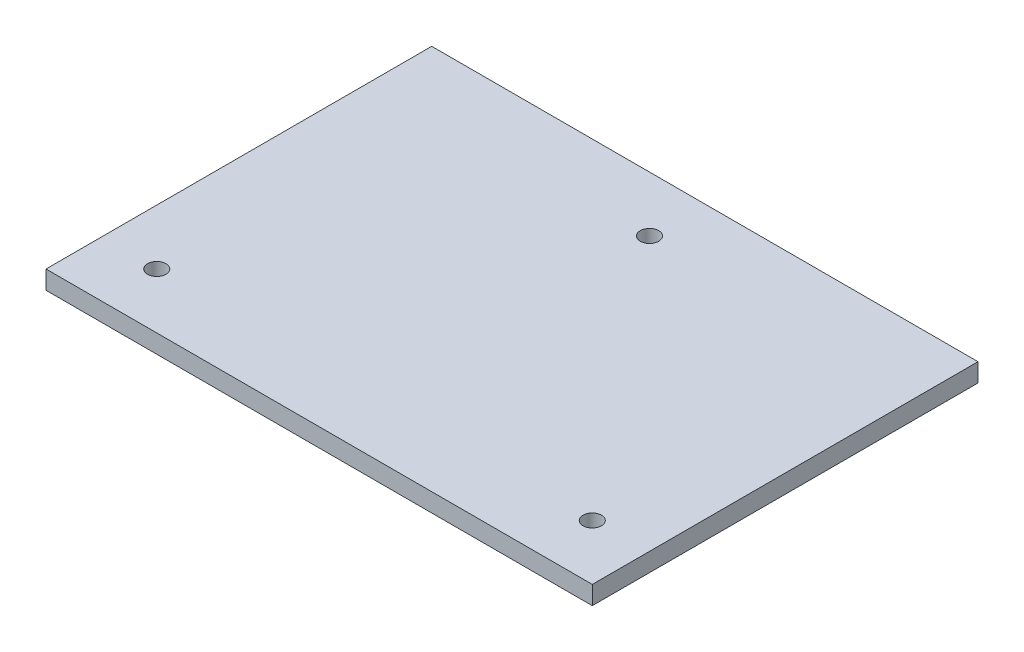
ISO-10303-21;
HEADER;
FILE_DESCRIPTION(('STEP AP214'),'2;1');
FILE_NAME('part.step','',(''),(''),'','','');
FILE_SCHEMA(('AUTOMOTIVE_DESIGN { 1 0 10303 214 1 1 1 1 }'));
ENDSEC;
DATA;
#1=APPLICATION_CONTEXT('core data for automotive mechanical design processes');
#2=APPLICATION_PROTOCOL_DEFINITION('international standard','automotive_design',2000,#1);
#3=PRODUCT_CONTEXT('',#1,'mechanical');
#4=PRODUCT('Part','Part','',(#3));
#5=PRODUCT_RELATED_PRODUCT_CATEGORY('part','',(#4));
#6=PRODUCT_DEFINITION_FORMATION('','',#4);
#7=PRODUCT_DEFINITION_CONTEXT('part definition',#1,'design');
#8=PRODUCT_DEFINITION('design','',#6,#7);
#9=PRODUCT_DEFINITION_SHAPE('','',#8);
#10=(LENGTH_UNIT() NAMED_UNIT(*) SI_UNIT(.MILLI.,.METRE.));
#11=(NAMED_UNIT(*) PLANE_ANGLE_UNIT() SI_UNIT($,.RADIAN.));
#12=(NAMED_UNIT(*) SI_UNIT($,.STERADIAN.) SOLID_ANGLE_UNIT());
#13=UNCERTAINTY_MEASURE_WITH_UNIT(LENGTH_MEASURE(1.E-05),#10,'distance_accuracy_value','');
#14=(GEOMETRIC_REPRESENTATION_CONTEXT(3) GLOBAL_UNCERTAINTY_ASSIGNED_CONTEXT((#13)) GLOBAL_UNIT_ASSIGNED_CONTEXT((#10,
#11,#12)) REPRESENTATION_CONTEXT('',''));
#15=CARTESIAN_POINT('',(0.,0.,0.));
#16=DIRECTION('',(0.,0.,1.));
#17=DIRECTION('',(1.,0.,0.));
#18=AXIS2_PLACEMENT_3D('',#15,#16,#17);
#19=CARTESIAN_POINT('',(148.,10.,104.5));
#20=DIRECTION('',(-1.,0.,0.));
#21=DIRECTION('',(0.,0.,1.));
#22=AXIS2_PLACEMENT_3D('',#19,#20,#21);
#23=PLANE('',#22);
#24=DIRECTION('',(0.,0.,-1.));
#25=VECTOR('',#24,1.);
#26=CARTESIAN_POINT('',(148.,0.,104.5));
#27=LINE('',#26,#25);
#28=CARTESIAN_POINT('',(148.,0.,104.5));
#29=VERTEX_POINT('',#28);
#30=CARTESIAN_POINT('',(148.,0.,-104.5));
#31=VERTEX_POINT('',#30);
#32=EDGE_CURVE('E94',#29,#31,#27,.T.);
#33=ORIENTED_EDGE('',*,*,#32,.T.);
#34=DIRECTION('',(0.,-1.,0.));
#35=VECTOR('',#34,1.);
#36=CARTESIAN_POINT('',(148.,10.,-104.5));
#37=LINE('',#36,#35);
#38=CARTESIAN_POINT('',(148.,10.,-104.5));
#39=VERTEX_POINT('',#38);
#40=EDGE_CURVE('E11',#39,#31,#37,.T.);
#41=ORIENTED_EDGE('',*,*,#40,.F.);
#42=DIRECTION('',(0.,0.,-1.));
#43=VECTOR('',#42,1.);
#44=CARTESIAN_POINT('',(148.,10.,104.5));
#45=LINE('',#44,#43);
#46=CARTESIAN_POINT('',(148.,10.,104.5));
#47=VERTEX_POINT('',#46);
#48=EDGE_CURVE('E82',#47,#39,#45,.T.);
#49=ORIENTED_EDGE('',*,*,#48,.F.);
#50=DIRECTION('',(0.,-1.,0.));
#51=VECTOR('',#50,1.);
#52=CARTESIAN_POINT('',(148.,10.,104.5));
#53=LINE('',#52,#51);
#54=EDGE_CURVE('E90',#47,#29,#53,.T.);
#55=ORIENTED_EDGE('',*,*,#54,.T.);
#56=EDGE_LOOP('',(#33,#41,#49,#55));
#57=FACE_BOUND('',#56,.T.);
#58=ADVANCED_FACE('F31',(#57),#23,.F.);
#59=CARTESIAN_POINT('',(-148.,10.,-104.5));
#60=DIRECTION('',(0.,0.,1.));
#61=DIRECTION('',(1.,0.,0.));
#62=AXIS2_PLACEMENT_3D('',#59,#60,#61);
#63=PLANE('',#62);
#64=DIRECTION('',(-1.,0.,0.));
#65=VECTOR('',#64,1.);
#66=CARTESIAN_POINT('',(-148.,0.,-104.5));
#67=LINE('',#66,#65);
#68=CARTESIAN_POINT('',(-148.,0.,-104.5));
#69=VERTEX_POINT('',#68);
#70=EDGE_CURVE('E86',#31,#69,#67,.T.);
#71=ORIENTED_EDGE('',*,*,#70,.T.);
#72=DIRECTION('',(0.,-1.,0.));
#73=VECTOR('',#72,1.);
#74=CARTESIAN_POINT('',(-148.,10.,-104.5));
#75=LINE('',#74,#73);
#76=CARTESIAN_POINT('',(-148.,10.,-104.5));
#77=VERTEX_POINT('',#76);
#78=EDGE_CURVE('E39',#77,#69,#75,.T.);
#79=ORIENTED_EDGE('',*,*,#78,.F.);
#80=DIRECTION('',(-1.,0.,0.));
#81=VECTOR('',#80,1.);
#82=CARTESIAN_POINT('',(-148.,10.,-104.5));
#83=LINE('',#82,#81);
#84=EDGE_CURVE('E77',#39,#77,#83,.T.);
#85=ORIENTED_EDGE('',*,*,#84,.F.);
#86=ORIENTED_EDGE('',*,*,#40,.T.);
#87=EDGE_LOOP('',(#71,#79,#85,#86));
#88=FACE_BOUND('',#87,.T.);
#89=ADVANCED_FACE('F85',(#88),#63,.F.);
#90=CARTESIAN_POINT('',(-148.,10.,104.5));
#91=DIRECTION('',(1.,0.,0.));
#92=DIRECTION('',(0.,0.,-1.));
#93=AXIS2_PLACEMENT_3D('',#90,#91,#92);
#94=PLANE('',#93);
#95=DIRECTION('',(0.,0.,1.));
#96=VECTOR('',#95,1.);
#97=CARTESIAN_POINT('',(-148.,0.,104.5));
#98=LINE('',#97,#96);
#99=CARTESIAN_POINT('',(-148.,0.,104.5));
#100=VERTEX_POINT('',#99);
#101=EDGE_CURVE('E64',#69,#100,#98,.T.);
#102=ORIENTED_EDGE('',*,*,#101,.T.);
#103=DIRECTION('',(0.,-1.,0.));
#104=VECTOR('',#103,1.);
#105=CARTESIAN_POINT('',(-148.,10.,104.5));
#106=LINE('',#105,#104);
#107=CARTESIAN_POINT('',(-148.,10.,104.5));
#108=VERTEX_POINT('',#107);
#109=EDGE_CURVE('E87',#108,#100,#106,.T.);
#110=ORIENTED_EDGE('',*,*,#109,.F.);
#111=DIRECTION('',(0.,0.,1.));
#112=VECTOR('',#111,1.);
#113=CARTESIAN_POINT('',(-148.,10.,104.5));
#114=LINE('',#113,#112);
#115=EDGE_CURVE('E80',#77,#108,#114,.T.);
#116=ORIENTED_EDGE('',*,*,#115,.F.);
#117=ORIENTED_EDGE('',*,*,#78,.T.);
#118=EDGE_LOOP('',(#102,#110,#116,#117));
#119=FACE_BOUND('',#118,.T.);
#120=ADVANCED_FACE('F88',(#119),#94,.F.);
#121=CARTESIAN_POINT('',(-148.,10.,104.5));
#122=DIRECTION('',(0.,0.,-1.));
#123=DIRECTION('',(-1.,0.,0.));
#124=AXIS2_PLACEMENT_3D('',#121,#122,#123);
#125=PLANE('',#124);
#126=DIRECTION('',(1.,0.,0.));
#127=VECTOR('',#126,1.);
#128=CARTESIAN_POINT('',(-148.,0.,104.5));
#129=LINE('',#128,#127);
#130=EDGE_CURVE('E70',#100,#29,#129,.T.);
#131=ORIENTED_EDGE('',*,*,#130,.T.);
#132=ORIENTED_EDGE('',*,*,#54,.F.);
#133=DIRECTION('',(1.,0.,0.));
#134=VECTOR('',#133,1.);
#135=CARTESIAN_POINT('',(-148.,10.,104.5));
#136=LINE('',#135,#134);
#137=EDGE_CURVE('E47',#108,#47,#136,.T.);
#138=ORIENTED_EDGE('',*,*,#137,.F.);
#139=ORIENTED_EDGE('',*,*,#109,.T.);
#140=EDGE_LOOP('',(#131,#132,#138,#139));
#141=FACE_BOUND('',#140,.T.);
#142=ADVANCED_FACE('F102',(#141),#125,.F.);
#143=CARTESIAN_POINT('',(148.,10.,-104.5));
#144=DIRECTION('',(0.,-1.,0.));
#145=DIRECTION('',(0.,0.,-1.));
#146=AXIS2_PLACEMENT_3D('',#143,#144,#145);
#147=PLANE('',#146);
#148=CARTESIAN_POINT('',(0.,10.,-74.5));
#149=DIRECTION('',(0.,-1.,0.));
#150=DIRECTION('',(0.,0.,-1.));
#151=AXIS2_PLACEMENT_3D('',#148,#149,#150);
#152=CIRCLE('',#151,5.);
#153=CARTESIAN_POINT('',(0.,10.,-79.5));
#154=VERTEX_POINT('',#153);
#155=EDGE_CURVE('E119',#154,#154,#152,.F.);
#156=ORIENTED_EDGE('',*,*,#155,.F.);
#157=EDGE_LOOP('',(#156));
#158=FACE_BOUND('',#157,.T.);
#159=CARTESIAN_POINT('',(118.,10.,74.5));
#160=DIRECTION('',(0.,-1.,0.));
#161=DIRECTION('',(0.,0.,-1.));
#162=AXIS2_PLACEMENT_3D('',#159,#160,#161);
#163=CIRCLE('',#162,5.00000000000001);
#164=CARTESIAN_POINT('',(118.,10.,69.5));
#165=VERTEX_POINT('',#164);
#166=EDGE_CURVE('E113',#165,#165,#163,.F.);
#167=ORIENTED_EDGE('',*,*,#166,.F.);
#168=EDGE_LOOP('',(#167));
#169=FACE_BOUND('',#168,.T.);
#170=CARTESIAN_POINT('',(-118.,10.,74.5));
#171=DIRECTION('',(0.,-1.,0.));
#172=DIRECTION('',(0.,0.,-1.));
#173=AXIS2_PLACEMENT_3D('',#170,#171,#172);
#174=CIRCLE('',#173,5.00000000000001);
#175=CARTESIAN_POINT('',(-118.,10.,69.5));
#176=VERTEX_POINT('',#175);
#177=EDGE_CURVE('E97',#176,#176,#174,.F.);
#178=ORIENTED_EDGE('',*,*,#177,.F.);
#179=EDGE_LOOP('',(#178));
#180=FACE_BOUND('',#179,.T.);
#181=ORIENTED_EDGE('',*,*,#48,.T.);
#182=ORIENTED_EDGE('',*,*,#84,.T.);
#183=ORIENTED_EDGE('',*,*,#115,.T.);
#184=ORIENTED_EDGE('',*,*,#137,.T.);
#185=EDGE_LOOP('',(#181,#182,#183,#184));
#186=FACE_BOUND('',#185,.T.);
#187=ADVANCED_FACE('F78',(#158,#169,#180,#186),#147,.F.);
#188=CARTESIAN_POINT('',(148.,0.,-104.5));
#189=DIRECTION('',(0.,-1.,0.));
#190=DIRECTION('',(0.,0.,-1.));
#191=AXIS2_PLACEMENT_3D('',#188,#189,#190);
#192=PLANE('',#191);
#193=CARTESIAN_POINT('',(0.,0.,-74.5));
#194=DIRECTION('',(0.,-1.,0.));
#195=DIRECTION('',(0.,0.,-1.));
#196=AXIS2_PLACEMENT_3D('',#193,#194,#195);
#197=CIRCLE('',#196,5.);
#198=CARTESIAN_POINT('',(0.,0.,-79.5));
#199=VERTEX_POINT('',#198);
#200=EDGE_CURVE('E122',#199,#199,#197,.T.);
#201=ORIENTED_EDGE('',*,*,#200,.F.);
#202=EDGE_LOOP('',(#201));
#203=FACE_BOUND('',#202,.T.);
#204=CARTESIAN_POINT('',(118.,0.,74.5));
#205=DIRECTION('',(0.,-1.,0.));
#206=DIRECTION('',(0.,0.,-1.));
#207=AXIS2_PLACEMENT_3D('',#204,#205,#206);
#208=CIRCLE('',#207,5.00000000000001);
#209=CARTESIAN_POINT('',(118.,0.,69.5));
#210=VERTEX_POINT('',#209);
#211=EDGE_CURVE('E116',#210,#210,#208,.T.);
#212=ORIENTED_EDGE('',*,*,#211,.F.);
#213=EDGE_LOOP('',(#212));
#214=FACE_BOUND('',#213,.T.);
#215=CARTESIAN_POINT('',(-118.,0.,74.5));
#216=DIRECTION('',(0.,-1.,0.));
#217=DIRECTION('',(0.,0.,-1.));
#218=AXIS2_PLACEMENT_3D('',#215,#216,#217);
#219=CIRCLE('',#218,5.00000000000001);
#220=CARTESIAN_POINT('',(-118.,0.,69.5));
#221=VERTEX_POINT('',#220);
#222=EDGE_CURVE('E110',#221,#221,#219,.T.);
#223=ORIENTED_EDGE('',*,*,#222,.F.);
#224=EDGE_LOOP('',(#223));
#225=FACE_BOUND('',#224,.T.);
#226=ORIENTED_EDGE('',*,*,#32,.F.);
#227=ORIENTED_EDGE('',*,*,#130,.F.);
#228=ORIENTED_EDGE('',*,*,#101,.F.);
#229=ORIENTED_EDGE('',*,*,#70,.F.);
#230=EDGE_LOOP('',(#226,#227,#228,#229));
#231=FACE_BOUND('',#230,.T.);
#232=ADVANCED_FACE('F105',(#203,#214,#225,#231),#192,.T.);
#233=CARTESIAN_POINT('',(-118.,10.001,74.5));
#234=DIRECTION('',(0.,-1.,0.));
#235=DIRECTION('',(0.,0.,-1.));
#236=AXIS2_PLACEMENT_3D('',#233,#234,#235);
#237=CYLINDRICAL_SURFACE('',#236,5.00000000000001);
#238=ORIENTED_EDGE('',*,*,#222,.T.);
#239=EDGE_LOOP('',(#238));
#240=FACE_BOUND('',#239,.T.);
#241=ORIENTED_EDGE('',*,*,#177,.T.);
#242=EDGE_LOOP('',(#241));
#243=FACE_BOUND('',#242,.T.);
#244=ADVANCED_FACE('F131',(#240,#243),#237,.F.);
#245=CARTESIAN_POINT('',(118.,10.001,74.5));
#246=DIRECTION('',(0.,-1.,0.));
#247=DIRECTION('',(0.,0.,-1.));
#248=AXIS2_PLACEMENT_3D('',#245,#246,#247);
#249=CYLINDRICAL_SURFACE('',#248,5.00000000000001);
#250=ORIENTED_EDGE('',*,*,#211,.T.);
#251=EDGE_LOOP('',(#250));
#252=FACE_BOUND('',#251,.T.);
#253=ORIENTED_EDGE('',*,*,#166,.T.);
#254=EDGE_LOOP('',(#253));
#255=FACE_BOUND('',#254,.T.);
#256=ADVANCED_FACE('F139',(#252,#255),#249,.F.);
#257=CARTESIAN_POINT('',(0.,10.001,-74.5));
#258=DIRECTION('',(0.,-1.,0.));
#259=DIRECTION('',(0.,0.,-1.));
#260=AXIS2_PLACEMENT_3D('',#257,#258,#259);
#261=CYLINDRICAL_SURFACE('',#260,5.);
#262=ORIENTED_EDGE('',*,*,#200,.T.);
#263=EDGE_LOOP('',(#262));
#264=FACE_BOUND('',#263,.T.);
#265=ORIENTED_EDGE('',*,*,#155,.T.);
#266=EDGE_LOOP('',(#265));
#267=FACE_BOUND('',#266,.T.);
#268=ADVANCED_FACE('F126',(#264,#267),#261,.F.);
#269=CLOSED_SHELL('',(#58,#89,#120,#142,#187,#232,#244,#256,#268));
#270=MANIFOLD_SOLID_BREP('B2',#269);
#271=ADVANCED_BREP_SHAPE_REPRESENTATION('',(#18,#270),#14);
#272=SHAPE_DEFINITION_REPRESENTATION(#9,#271);
ENDSEC;
END-ISO-10303-21;
